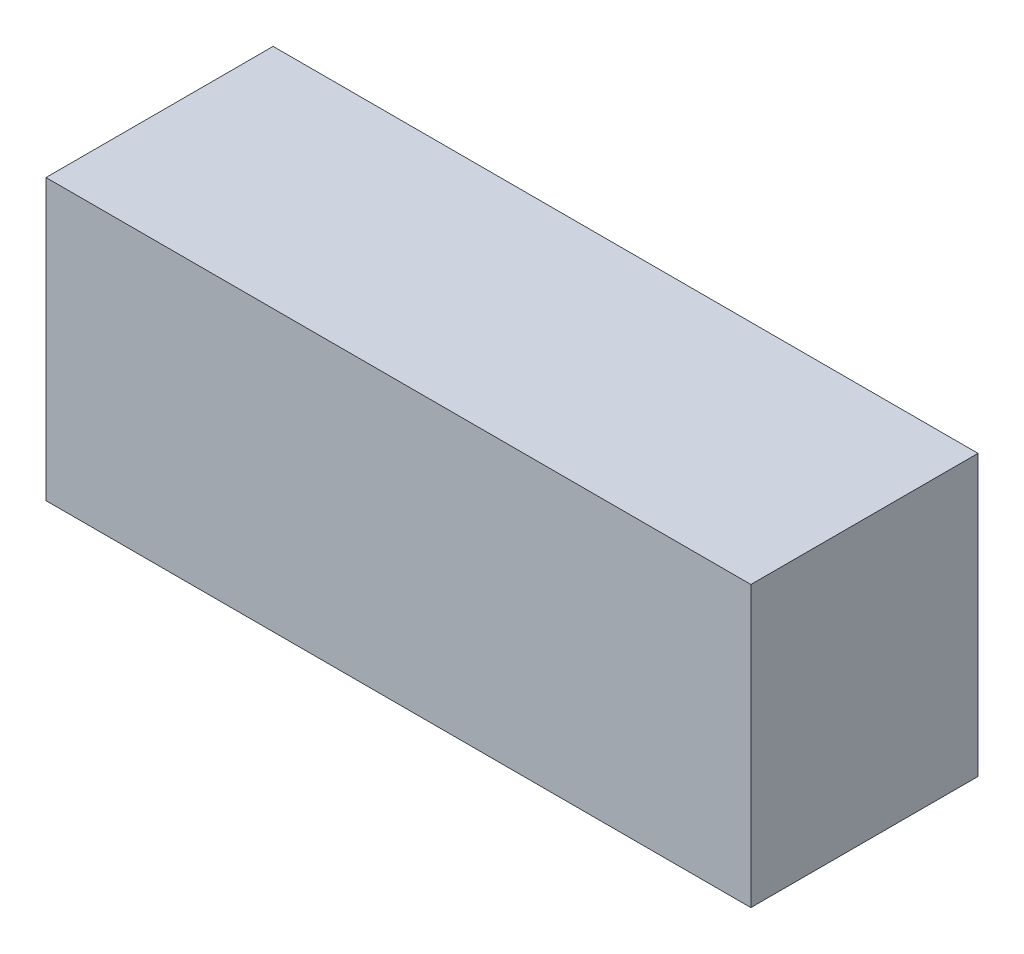
ISO-10303-21;
HEADER;
FILE_DESCRIPTION(('STEP AP214'),'2;1');
FILE_NAME('part.step','',(''),(''),'','','');
FILE_SCHEMA(('AUTOMOTIVE_DESIGN { 1 0 10303 214 1 1 1 1 }'));
ENDSEC;
DATA;
#1=APPLICATION_CONTEXT('core data for automotive mechanical design processes');
#2=APPLICATION_PROTOCOL_DEFINITION('international standard','automotive_design',2000,#1);
#3=PRODUCT_CONTEXT('',#1,'mechanical');
#4=PRODUCT('Part','Part','',(#3));
#5=PRODUCT_RELATED_PRODUCT_CATEGORY('part','',(#4));
#6=PRODUCT_DEFINITION_FORMATION('','',#4);
#7=PRODUCT_DEFINITION_CONTEXT('part definition',#1,'design');
#8=PRODUCT_DEFINITION('design','',#6,#7);
#9=PRODUCT_DEFINITION_SHAPE('','',#8);
#10=(LENGTH_UNIT() NAMED_UNIT(*) SI_UNIT(.MILLI.,.METRE.));
#11=(NAMED_UNIT(*) PLANE_ANGLE_UNIT() SI_UNIT($,.RADIAN.));
#12=(NAMED_UNIT(*) SI_UNIT($,.STERADIAN.) SOLID_ANGLE_UNIT());
#13=UNCERTAINTY_MEASURE_WITH_UNIT(LENGTH_MEASURE(1.E-05),#10,'distance_accuracy_value','');
#14=(GEOMETRIC_REPRESENTATION_CONTEXT(3) GLOBAL_UNCERTAINTY_ASSIGNED_CONTEXT((#13)) GLOBAL_UNIT_ASSIGNED_CONTEXT((#10,
#11,#12)) REPRESENTATION_CONTEXT('',''));
#15=CARTESIAN_POINT('',(0.,0.,0.));
#16=DIRECTION('',(0.,0.,1.));
#17=DIRECTION('',(1.,0.,0.));
#18=AXIS2_PLACEMENT_3D('',#15,#16,#17);
#19=CARTESIAN_POINT('',(67.5,53.6,21.75));
#20=DIRECTION('',(-1.,0.,0.));
#21=DIRECTION('',(0.,0.,1.));
#22=AXIS2_PLACEMENT_3D('',#19,#20,#21);
#23=PLANE('',#22);
#24=DIRECTION('',(0.,0.,-1.));
#25=VECTOR('',#24,1.);
#26=CARTESIAN_POINT('',(67.5,0.,21.75));
#27=LINE('',#26,#25);
#28=CARTESIAN_POINT('',(67.5,0.,21.75));
#29=VERTEX_POINT('',#28);
#30=CARTESIAN_POINT('',(67.5,0.,-21.75));
#31=VERTEX_POINT('',#30);
#32=EDGE_CURVE('E107',#29,#31,#27,.T.);
#33=ORIENTED_EDGE('',*,*,#32,.T.);
#34=DIRECTION('',(0.,-1.,0.));
#35=VECTOR('',#34,1.);
#36=CARTESIAN_POINT('',(67.5,53.6,-21.75));
#37=LINE('',#36,#35);
#38=CARTESIAN_POINT('',(67.5,53.6,-21.75));
#39=VERTEX_POINT('',#38);
#40=EDGE_CURVE('E11',#39,#31,#37,.T.);
#41=ORIENTED_EDGE('',*,*,#40,.F.);
#42=DIRECTION('',(0.,0.,-1.));
#43=VECTOR('',#42,1.);
#44=CARTESIAN_POINT('',(67.5,53.6,21.75));
#45=LINE('',#44,#43);
#46=CARTESIAN_POINT('',(67.5,53.6,21.75));
#47=VERTEX_POINT('',#46);
#48=EDGE_CURVE('E91',#47,#39,#45,.T.);
#49=ORIENTED_EDGE('',*,*,#48,.F.);
#50=DIRECTION('',(0.,-1.,0.));
#51=VECTOR('',#50,1.);
#52=CARTESIAN_POINT('',(67.5,53.6,21.75));
#53=LINE('',#52,#51);
#54=EDGE_CURVE('E103',#47,#29,#53,.T.);
#55=ORIENTED_EDGE('',*,*,#54,.T.);
#56=EDGE_LOOP('',(#33,#41,#49,#55));
#57=FACE_BOUND('',#56,.T.);
#58=ADVANCED_FACE('F39',(#57),#23,.F.);
#59=CARTESIAN_POINT('',(-67.5,53.6,-21.75));
#60=DIRECTION('',(0.,0.,1.));
#61=DIRECTION('',(1.,0.,0.));
#62=AXIS2_PLACEMENT_3D('',#59,#60,#61);
#63=PLANE('',#62);
#64=DIRECTION('',(-1.,0.,0.));
#65=VECTOR('',#64,1.);
#66=CARTESIAN_POINT('',(-67.5,0.,-21.75));
#67=LINE('',#66,#65);
#68=CARTESIAN_POINT('',(-67.5,0.,-21.75));
#69=VERTEX_POINT('',#68);
#70=EDGE_CURVE('E96',#31,#69,#67,.T.);
#71=ORIENTED_EDGE('',*,*,#70,.T.);
#72=DIRECTION('',(0.,-1.,0.));
#73=VECTOR('',#72,1.);
#74=CARTESIAN_POINT('',(-67.5,53.6,-21.75));
#75=LINE('',#74,#73);
#76=CARTESIAN_POINT('',(-67.5,53.6,-21.75));
#77=VERTEX_POINT('',#76);
#78=EDGE_CURVE('E48',#77,#69,#75,.T.);
#79=ORIENTED_EDGE('',*,*,#78,.F.);
#80=DIRECTION('',(-1.,0.,0.));
#81=VECTOR('',#80,1.);
#82=CARTESIAN_POINT('',(-67.5,53.6,-21.75));
#83=LINE('',#82,#81);
#84=EDGE_CURVE('E86',#39,#77,#83,.T.);
#85=ORIENTED_EDGE('',*,*,#84,.F.);
#86=ORIENTED_EDGE('',*,*,#40,.T.);
#87=EDGE_LOOP('',(#71,#79,#85,#86));
#88=FACE_BOUND('',#87,.T.);
#89=ADVANCED_FACE('F95',(#88),#63,.F.);
#90=CARTESIAN_POINT('',(-67.5,53.6,21.75));
#91=DIRECTION('',(1.,0.,0.));
#92=DIRECTION('',(0.,0.,-1.));
#93=AXIS2_PLACEMENT_3D('',#90,#91,#92);
#94=PLANE('',#93);
#95=DIRECTION('',(0.,0.,1.));
#96=VECTOR('',#95,1.);
#97=CARTESIAN_POINT('',(-67.5,0.,21.75));
#98=LINE('',#97,#96);
#99=CARTESIAN_POINT('',(-67.5,0.,21.75));
#100=VERTEX_POINT('',#99);
#101=EDGE_CURVE('E73',#69,#100,#98,.T.);
#102=ORIENTED_EDGE('',*,*,#101,.T.);
#103=DIRECTION('',(0.,-1.,0.));
#104=VECTOR('',#103,1.);
#105=CARTESIAN_POINT('',(-67.5,53.6,21.75));
#106=LINE('',#105,#104);
#107=CARTESIAN_POINT('',(-67.5,53.6,21.75));
#108=VERTEX_POINT('',#107);
#109=EDGE_CURVE('E98',#108,#100,#106,.T.);
#110=ORIENTED_EDGE('',*,*,#109,.F.);
#111=DIRECTION('',(0.,0.,1.));
#112=VECTOR('',#111,1.);
#113=CARTESIAN_POINT('',(-67.5,53.6,21.75));
#114=LINE('',#113,#112);
#115=EDGE_CURVE('E89',#77,#108,#114,.T.);
#116=ORIENTED_EDGE('',*,*,#115,.F.);
#117=ORIENTED_EDGE('',*,*,#78,.T.);
#118=EDGE_LOOP('',(#102,#110,#116,#117));
#119=FACE_BOUND('',#118,.T.);
#120=ADVANCED_FACE('F99',(#119),#94,.F.);
#121=CARTESIAN_POINT('',(-67.5,53.6,21.75));
#122=DIRECTION('',(0.,0.,-1.));
#123=DIRECTION('',(-1.,0.,0.));
#124=AXIS2_PLACEMENT_3D('',#121,#122,#123);
#125=PLANE('',#124);
#126=DIRECTION('',(1.,0.,0.));
#127=VECTOR('',#126,1.);
#128=CARTESIAN_POINT('',(-67.5,0.,21.75));
#129=LINE('',#128,#127);
#130=EDGE_CURVE('E79',#100,#29,#129,.T.);
#131=ORIENTED_EDGE('',*,*,#130,.T.);
#132=ORIENTED_EDGE('',*,*,#54,.F.);
#133=DIRECTION('',(1.,0.,0.));
#134=VECTOR('',#133,1.);
#135=CARTESIAN_POINT('',(-67.5,53.6,21.75));
#136=LINE('',#135,#134);
#137=EDGE_CURVE('E56',#108,#47,#136,.T.);
#138=ORIENTED_EDGE('',*,*,#137,.F.);
#139=ORIENTED_EDGE('',*,*,#109,.T.);
#140=EDGE_LOOP('',(#131,#132,#138,#139));
#141=FACE_BOUND('',#140,.T.);
#142=ADVANCED_FACE('F120',(#141),#125,.F.);
#143=CARTESIAN_POINT('',(0.,53.6,0.));
#144=DIRECTION('',(0.,-1.,0.));
#145=DIRECTION('',(0.,0.,-1.));
#146=AXIS2_PLACEMENT_3D('',#143,#144,#145);
#147=PLANE('',#146);
#148=ORIENTED_EDGE('',*,*,#48,.T.);
#149=ORIENTED_EDGE('',*,*,#84,.T.);
#150=ORIENTED_EDGE('',*,*,#115,.T.);
#151=ORIENTED_EDGE('',*,*,#137,.T.);
#152=EDGE_LOOP('',(#148,#149,#150,#151));
#153=FACE_BOUND('',#152,.T.);
#154=ADVANCED_FACE('F87',(#153),#147,.F.);
#155=CARTESIAN_POINT('',(0.,0.,0.));
#156=DIRECTION('',(0.,-1.,0.));
#157=DIRECTION('',(0.,0.,-1.));
#158=AXIS2_PLACEMENT_3D('',#155,#156,#157);
#159=PLANE('',#158);
#160=ORIENTED_EDGE('',*,*,#32,.F.);
#161=ORIENTED_EDGE('',*,*,#130,.F.);
#162=ORIENTED_EDGE('',*,*,#101,.F.);
#163=ORIENTED_EDGE('',*,*,#70,.F.);
#164=EDGE_LOOP('',(#160,#161,#162,#163));
#165=FACE_BOUND('',#164,.T.);
#166=ADVANCED_FACE('F123',(#165),#159,.T.);
#167=CLOSED_SHELL('',(#58,#89,#120,#142,#154,#166));
#168=MANIFOLD_SOLID_BREP('B2',#167);
#169=ADVANCED_BREP_SHAPE_REPRESENTATION('',(#18,#168),#14);
#170=SHAPE_DEFINITION_REPRESENTATION(#9,#169);
ENDSEC;
END-ISO-10303-21;
